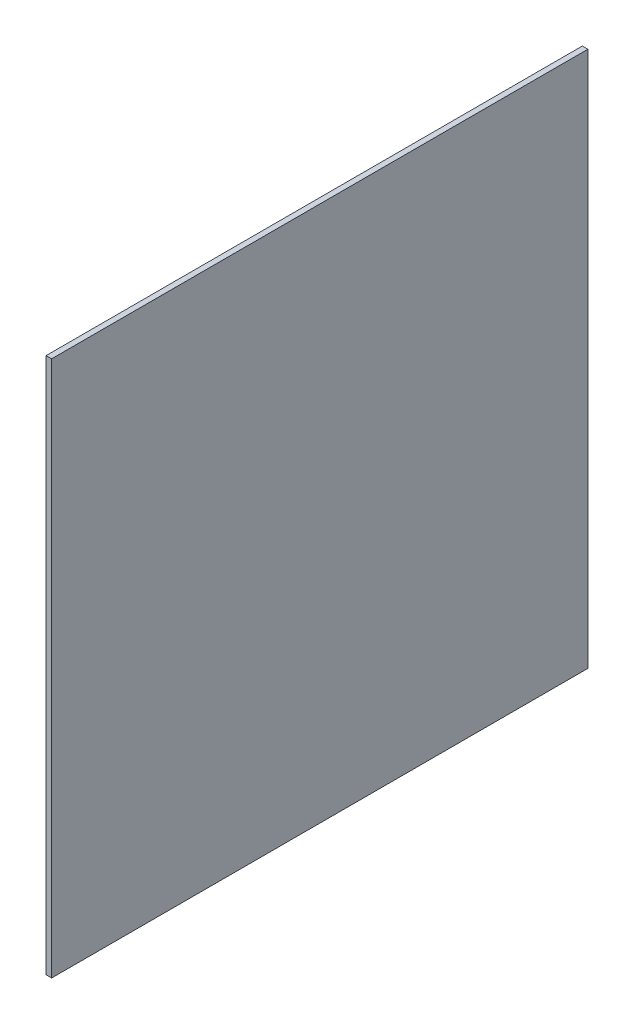
ISO-10303-21;
HEADER;
FILE_DESCRIPTION(('STEP AP214'),'2;1');
FILE_NAME('part.step','',(''),(''),'','','');
FILE_SCHEMA(('AUTOMOTIVE_DESIGN { 1 0 10303 214 1 1 1 1 }'));
ENDSEC;
DATA;
#1=APPLICATION_CONTEXT('core data for automotive mechanical design processes');
#2=APPLICATION_PROTOCOL_DEFINITION('international standard','automotive_design',2000,#1);
#3=PRODUCT_CONTEXT('',#1,'mechanical');
#4=PRODUCT('Part','Part','',(#3));
#5=PRODUCT_RELATED_PRODUCT_CATEGORY('part','',(#4));
#6=PRODUCT_DEFINITION_FORMATION('','',#4);
#7=PRODUCT_DEFINITION_CONTEXT('part definition',#1,'design');
#8=PRODUCT_DEFINITION('design','',#6,#7);
#9=PRODUCT_DEFINITION_SHAPE('','',#8);
#10=(LENGTH_UNIT() NAMED_UNIT(*) SI_UNIT(.MILLI.,.METRE.));
#11=(NAMED_UNIT(*) PLANE_ANGLE_UNIT() SI_UNIT($,.RADIAN.));
#12=(NAMED_UNIT(*) SI_UNIT($,.STERADIAN.) SOLID_ANGLE_UNIT());
#13=UNCERTAINTY_MEASURE_WITH_UNIT(LENGTH_MEASURE(1.E-05),#10,'distance_accuracy_value','');
#14=(GEOMETRIC_REPRESENTATION_CONTEXT(3) GLOBAL_UNCERTAINTY_ASSIGNED_CONTEXT((#13)) GLOBAL_UNIT_ASSIGNED_CONTEXT((#10,
#11,#12)) REPRESENTATION_CONTEXT('',''));
#15=CARTESIAN_POINT('',(0.,0.,0.));
#16=DIRECTION('',(0.,0.,1.));
#17=DIRECTION('',(1.,0.,0.));
#18=AXIS2_PLACEMENT_3D('',#15,#16,#17);
#19=CARTESIAN_POINT('',(3.,50.68632150099,58.0652286592093));
#20=DIRECTION('',(0.,0.,-1.));
#21=DIRECTION('',(0.,1.,0.));
#22=AXIS2_PLACEMENT_3D('',#19,#20,#21);
#23=PLANE('',#22);
#24=DIRECTION('',(0.,-1.,0.));
#25=VECTOR('',#24,1.);
#26=CARTESIAN_POINT('',(0.,50.68632150099,58.0652286592093));
#27=LINE('',#26,#25);
#28=CARTESIAN_POINT('',(0.,50.68632150099,58.0652286592093));
#29=VERTEX_POINT('',#28);
#30=CARTESIAN_POINT('',(0.,-239.31367849901,58.0652286592092));
#31=VERTEX_POINT('',#30);
#32=EDGE_CURVE('E104',#29,#31,#27,.T.);
#33=ORIENTED_EDGE('',*,*,#32,.T.);
#34=DIRECTION('',(-1.,0.,0.));
#35=VECTOR('',#34,1.);
#36=CARTESIAN_POINT('',(3.,-239.31367849901,58.0652286592092));
#37=LINE('',#36,#35);
#38=CARTESIAN_POINT('',(3.,-239.31367849901,58.0652286592092));
#39=VERTEX_POINT('',#38);
#40=EDGE_CURVE('E11',#39,#31,#37,.T.);
#41=ORIENTED_EDGE('',*,*,#40,.F.);
#42=DIRECTION('',(0.,-1.,0.));
#43=VECTOR('',#42,1.);
#44=CARTESIAN_POINT('',(3.,50.68632150099,58.0652286592093));
#45=LINE('',#44,#43);
#46=CARTESIAN_POINT('',(3.,50.68632150099,58.0652286592093));
#47=VERTEX_POINT('',#46);
#48=EDGE_CURVE('E92',#47,#39,#45,.T.);
#49=ORIENTED_EDGE('',*,*,#48,.F.);
#50=DIRECTION('',(-1.,0.,0.));
#51=VECTOR('',#50,1.);
#52=CARTESIAN_POINT('',(3.,50.68632150099,58.0652286592093));
#53=LINE('',#52,#51);
#54=EDGE_CURVE('E100',#47,#29,#53,.T.);
#55=ORIENTED_EDGE('',*,*,#54,.T.);
#56=EDGE_LOOP('',(#33,#41,#49,#55));
#57=FACE_BOUND('',#56,.T.);
#58=ADVANCED_FACE('F41',(#57),#23,.F.);
#59=CARTESIAN_POINT('',(3.,-239.31367849901,58.0652286592092));
#60=DIRECTION('',(0.,1.,0.));
#61=DIRECTION('',(0.,0.,1.));
#62=AXIS2_PLACEMENT_3D('',#59,#60,#61);
#63=PLANE('',#62);
#64=DIRECTION('',(0.,0.,-1.));
#65=VECTOR('',#64,1.);
#66=CARTESIAN_POINT('',(0.,-239.31367849901,58.0652286592092));
#67=LINE('',#66,#65);
#68=CARTESIAN_POINT('',(0.,-239.31367849901,-231.934771340791));
#69=VERTEX_POINT('',#68);
#70=EDGE_CURVE('E96',#31,#69,#67,.T.);
#71=ORIENTED_EDGE('',*,*,#70,.T.);
#72=DIRECTION('',(-1.,0.,0.));
#73=VECTOR('',#72,1.);
#74=CARTESIAN_POINT('',(3.,-239.31367849901,-231.934771340791));
#75=LINE('',#74,#73);
#76=CARTESIAN_POINT('',(3.,-239.31367849901,-231.934771340791));
#77=VERTEX_POINT('',#76);
#78=EDGE_CURVE('E49',#77,#69,#75,.T.);
#79=ORIENTED_EDGE('',*,*,#78,.F.);
#80=DIRECTION('',(0.,0.,-1.));
#81=VECTOR('',#80,1.);
#82=CARTESIAN_POINT('',(3.,-239.31367849901,58.0652286592092));
#83=LINE('',#82,#81);
#84=EDGE_CURVE('E87',#39,#77,#83,.T.);
#85=ORIENTED_EDGE('',*,*,#84,.F.);
#86=ORIENTED_EDGE('',*,*,#40,.T.);
#87=EDGE_LOOP('',(#71,#79,#85,#86));
#88=FACE_BOUND('',#87,.T.);
#89=ADVANCED_FACE('F95',(#88),#63,.F.);
#90=CARTESIAN_POINT('',(3.,50.68632150099,-231.934771340791));
#91=DIRECTION('',(0.,0.,1.));
#92=DIRECTION('',(0.,-1.,0.));
#93=AXIS2_PLACEMENT_3D('',#90,#91,#92);
#94=PLANE('',#93);
#95=DIRECTION('',(0.,1.,0.));
#96=VECTOR('',#95,1.);
#97=CARTESIAN_POINT('',(0.,50.68632150099,-231.934771340791));
#98=LINE('',#97,#96);
#99=CARTESIAN_POINT('',(0.,50.68632150099,-231.934771340791));
#100=VERTEX_POINT('',#99);
#101=EDGE_CURVE('E74',#69,#100,#98,.T.);
#102=ORIENTED_EDGE('',*,*,#101,.T.);
#103=DIRECTION('',(-1.,0.,0.));
#104=VECTOR('',#103,1.);
#105=CARTESIAN_POINT('',(3.,50.68632150099,-231.934771340791));
#106=LINE('',#105,#104);
#107=CARTESIAN_POINT('',(3.,50.68632150099,-231.934771340791));
#108=VERTEX_POINT('',#107);
#109=EDGE_CURVE('E97',#108,#100,#106,.T.);
#110=ORIENTED_EDGE('',*,*,#109,.F.);
#111=DIRECTION('',(0.,1.,0.));
#112=VECTOR('',#111,1.);
#113=CARTESIAN_POINT('',(3.,50.68632150099,-231.934771340791));
#114=LINE('',#113,#112);
#115=EDGE_CURVE('E90',#77,#108,#114,.T.);
#116=ORIENTED_EDGE('',*,*,#115,.F.);
#117=ORIENTED_EDGE('',*,*,#78,.T.);
#118=EDGE_LOOP('',(#102,#110,#116,#117));
#119=FACE_BOUND('',#118,.T.);
#120=ADVANCED_FACE('F98',(#119),#94,.F.);
#121=CARTESIAN_POINT('',(3.,50.68632150099,58.0652286592093));
#122=DIRECTION('',(0.,-1.,0.));
#123=DIRECTION('',(0.,0.,-1.));
#124=AXIS2_PLACEMENT_3D('',#121,#122,#123);
#125=PLANE('',#124);
#126=DIRECTION('',(0.,0.,1.));
#127=VECTOR('',#126,1.);
#128=CARTESIAN_POINT('',(0.,50.68632150099,58.0652286592093));
#129=LINE('',#128,#127);
#130=EDGE_CURVE('E80',#100,#29,#129,.T.);
#131=ORIENTED_EDGE('',*,*,#130,.T.);
#132=ORIENTED_EDGE('',*,*,#54,.F.);
#133=DIRECTION('',(0.,0.,1.));
#134=VECTOR('',#133,1.);
#135=CARTESIAN_POINT('',(3.,50.68632150099,58.0652286592093));
#136=LINE('',#135,#134);
#137=EDGE_CURVE('E57',#108,#47,#136,.T.);
#138=ORIENTED_EDGE('',*,*,#137,.F.);
#139=ORIENTED_EDGE('',*,*,#109,.T.);
#140=EDGE_LOOP('',(#131,#132,#138,#139));
#141=FACE_BOUND('',#140,.T.);
#142=ADVANCED_FACE('F111',(#141),#125,.F.);
#143=CARTESIAN_POINT('',(3.,0.,0.));
#144=DIRECTION('',(1.,0.,0.));
#145=DIRECTION('',(0.,0.,-1.));
#146=AXIS2_PLACEMENT_3D('',#143,#144,#145);
#147=PLANE('',#146);
#148=ORIENTED_EDGE('',*,*,#48,.T.);
#149=ORIENTED_EDGE('',*,*,#84,.T.);
#150=ORIENTED_EDGE('',*,*,#115,.T.);
#151=ORIENTED_EDGE('',*,*,#137,.T.);
#152=EDGE_LOOP('',(#148,#149,#150,#151));
#153=FACE_BOUND('',#152,.T.);
#154=ADVANCED_FACE('F88',(#153),#147,.T.);
#155=CARTESIAN_POINT('',(0.,0.,0.));
#156=DIRECTION('',(1.,0.,0.));
#157=DIRECTION('',(0.,0.,-1.));
#158=AXIS2_PLACEMENT_3D('',#155,#156,#157);
#159=PLANE('',#158);
#160=ORIENTED_EDGE('',*,*,#32,.F.);
#161=ORIENTED_EDGE('',*,*,#130,.F.);
#162=ORIENTED_EDGE('',*,*,#101,.F.);
#163=ORIENTED_EDGE('',*,*,#70,.F.);
#164=EDGE_LOOP('',(#160,#161,#162,#163));
#165=FACE_BOUND('',#164,.T.);
#166=ADVANCED_FACE('F114',(#165),#159,.F.);
#167=CLOSED_SHELL('',(#58,#89,#120,#142,#154,#166));
#168=MANIFOLD_SOLID_BREP('B2',#167);
#169=ADVANCED_BREP_SHAPE_REPRESENTATION('',(#18,#168),#14);
#170=SHAPE_DEFINITION_REPRESENTATION(#9,#169);
ENDSEC;
END-ISO-10303-21;
